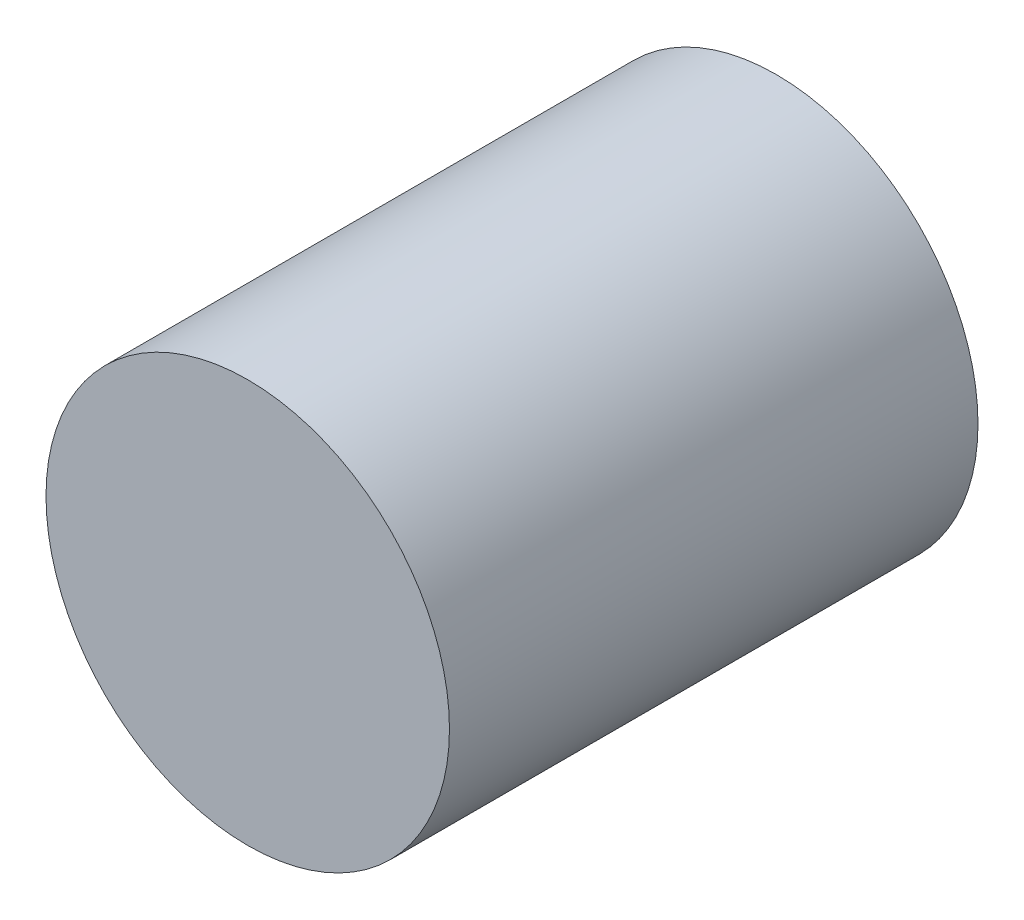
ISO-10303-21;
HEADER;
FILE_DESCRIPTION(('STEP AP214'),'2;1');
FILE_NAME('part.step','',(''),(''),'','','');
FILE_SCHEMA(('AUTOMOTIVE_DESIGN { 1 0 10303 214 1 1 1 1 }'));
ENDSEC;
DATA;
#1=APPLICATION_CONTEXT('core data for automotive mechanical design processes');
#2=APPLICATION_PROTOCOL_DEFINITION('international standard','automotive_design',2000,#1);
#3=PRODUCT_CONTEXT('',#1,'mechanical');
#4=PRODUCT('Part','Part','',(#3));
#5=PRODUCT_RELATED_PRODUCT_CATEGORY('part','',(#4));
#6=PRODUCT_DEFINITION_FORMATION('','',#4);
#7=PRODUCT_DEFINITION_CONTEXT('part definition',#1,'design');
#8=PRODUCT_DEFINITION('design','',#6,#7);
#9=PRODUCT_DEFINITION_SHAPE('','',#8);
#10=(LENGTH_UNIT() NAMED_UNIT(*) SI_UNIT(.MILLI.,.METRE.));
#11=(NAMED_UNIT(*) PLANE_ANGLE_UNIT() SI_UNIT($,.RADIAN.));
#12=(NAMED_UNIT(*) SI_UNIT($,.STERADIAN.) SOLID_ANGLE_UNIT());
#13=UNCERTAINTY_MEASURE_WITH_UNIT(LENGTH_MEASURE(1.E-05),#10,'distance_accuracy_value','');
#14=(GEOMETRIC_REPRESENTATION_CONTEXT(3) GLOBAL_UNCERTAINTY_ASSIGNED_CONTEXT((#13)) GLOBAL_UNIT_ASSIGNED_CONTEXT((#10,
#11,#12)) REPRESENTATION_CONTEXT('',''));
#15=CARTESIAN_POINT('',(0.,0.,0.));
#16=DIRECTION('',(0.,0.,1.));
#17=DIRECTION('',(1.,0.,0.));
#18=AXIS2_PLACEMENT_3D('',#15,#16,#17);
#19=CARTESIAN_POINT('',(0.,0.,0.));
#20=DIRECTION('',(0.,0.,1.));
#21=DIRECTION('',(1.,0.,0.));
#22=AXIS2_PLACEMENT_3D('',#19,#20,#21);
#23=PLANE('',#22);
#24=CARTESIAN_POINT('',(0.,0.,0.));
#25=DIRECTION('',(0.,0.,1.));
#26=DIRECTION('',(1.,0.,0.));
#27=AXIS2_PLACEMENT_3D('',#24,#25,#26);
#28=CIRCLE('',#27,10.);
#29=CARTESIAN_POINT('',(10.,0.,0.));
#30=VERTEX_POINT('',#29);
#31=EDGE_CURVE('E45',#30,#30,#28,.T.);
#32=ORIENTED_EDGE('',*,*,#31,.F.);
#33=EDGE_LOOP('',(#32));
#34=FACE_BOUND('',#33,.T.);
#35=CARTESIAN_POINT('',(0.,0.,0.));
#36=DIRECTION('',(0.,0.,1.));
#37=DIRECTION('',(1.,0.,0.));
#38=AXIS2_PLACEMENT_3D('',#35,#36,#37);
#39=CIRCLE('',#38,8.);
#40=CARTESIAN_POINT('',(8.,0.,0.));
#41=VERTEX_POINT('',#40);
#42=EDGE_CURVE('E50',#41,#41,#39,.T.);
#43=ORIENTED_EDGE('',*,*,#42,.T.);
#44=EDGE_LOOP('',(#43));
#45=FACE_BOUND('',#44,.T.);
#46=ADVANCED_FACE('F37',(#34,#45),#23,.F.);
#47=CARTESIAN_POINT('',(0.,0.,24.2));
#48=DIRECTION('',(0.,0.,-1.));
#49=DIRECTION('',(-1.,0.,0.));
#50=AXIS2_PLACEMENT_3D('',#47,#48,#49);
#51=CYLINDRICAL_SURFACE('',#50,10.);
#52=ORIENTED_EDGE('',*,*,#31,.T.);
#53=EDGE_LOOP('',(#52));
#54=FACE_BOUND('',#53,.T.);
#55=CARTESIAN_POINT('',(0.,0.,26.2));
#56=DIRECTION('',(0.,0.,1.));
#57=DIRECTION('',(1.,0.,0.));
#58=AXIS2_PLACEMENT_3D('',#55,#56,#57);
#59=CIRCLE('',#58,10.);
#60=CARTESIAN_POINT('',(10.,0.,26.2));
#61=VERTEX_POINT('',#60);
#62=EDGE_CURVE('E61',#61,#61,#59,.T.);
#63=ORIENTED_EDGE('',*,*,#62,.F.);
#64=EDGE_LOOP('',(#63));
#65=FACE_BOUND('',#64,.T.);
#66=ADVANCED_FACE('F39',(#54,#65),#51,.T.);
#67=CARTESIAN_POINT('',(0.,0.,24.2));
#68=DIRECTION('',(0.,0.,-1.));
#69=DIRECTION('',(-1.,0.,0.));
#70=AXIS2_PLACEMENT_3D('',#67,#68,#69);
#71=CYLINDRICAL_SURFACE('',#70,8.);
#72=CARTESIAN_POINT('',(0.,0.,24.2));
#73=DIRECTION('',(0.,0.,1.));
#74=DIRECTION('',(1.,0.,0.));
#75=AXIS2_PLACEMENT_3D('',#72,#73,#74);
#76=CIRCLE('',#75,8.);
#77=CARTESIAN_POINT('',(8.,0.,24.2));
#78=VERTEX_POINT('',#77);
#79=EDGE_CURVE('E55',#78,#78,#76,.T.);
#80=ORIENTED_EDGE('',*,*,#79,.T.);
#81=EDGE_LOOP('',(#80));
#82=FACE_BOUND('',#81,.T.);
#83=ORIENTED_EDGE('',*,*,#42,.F.);
#84=EDGE_LOOP('',(#83));
#85=FACE_BOUND('',#84,.T.);
#86=ADVANCED_FACE('F85',(#82,#85),#71,.F.);
#87=CARTESIAN_POINT('',(0.,0.,24.2));
#88=DIRECTION('',(0.,0.,1.));
#89=DIRECTION('',(1.,0.,0.));
#90=AXIS2_PLACEMENT_3D('',#87,#88,#89);
#91=PLANE('',#90);
#92=CARTESIAN_POINT('',(0.,0.,24.2));
#93=DIRECTION('',(0.,0.,1.));
#94=DIRECTION('',(1.,0.,0.));
#95=AXIS2_PLACEMENT_3D('',#92,#93,#94);
#96=CIRCLE('',#95,3.);
#97=CARTESIAN_POINT('',(3.,0.,24.2));
#98=VERTEX_POINT('',#97);
#99=EDGE_CURVE('E10',#98,#98,#96,.F.);
#100=ORIENTED_EDGE('',*,*,#99,.F.);
#101=EDGE_LOOP('',(#100));
#102=FACE_BOUND('',#101,.T.);
#103=ORIENTED_EDGE('',*,*,#79,.F.);
#104=EDGE_LOOP('',(#103));
#105=FACE_BOUND('',#104,.T.);
#106=ADVANCED_FACE('F90',(#102,#105),#91,.F.);
#107=CARTESIAN_POINT('',(0.,0.,26.2));
#108=DIRECTION('',(0.,0.,1.));
#109=DIRECTION('',(1.,0.,0.));
#110=AXIS2_PLACEMENT_3D('',#107,#108,#109);
#111=PLANE('',#110);
#112=ORIENTED_EDGE('',*,*,#62,.T.);
#113=EDGE_LOOP('',(#112));
#114=FACE_BOUND('',#113,.T.);
#115=ADVANCED_FACE('F78',(#114),#111,.T.);
#116=CARTESIAN_POINT('',(0.,0.,-8.48528137423857));
#117=DIRECTION('',(0.,0.,1.));
#118=DIRECTION('',(1.,0.,0.));
#119=AXIS2_PLACEMENT_3D('',#116,#117,#118);
#120=CYLINDRICAL_SURFACE('',#119,3.);
#121=CARTESIAN_POINT('',(0.,0.,0.));
#122=DIRECTION('',(0.,0.,1.));
#123=DIRECTION('',(1.,0.,0.));
#124=AXIS2_PLACEMENT_3D('',#121,#122,#123);
#125=CIRCLE('',#124,3.);
#126=CARTESIAN_POINT('',(3.,0.,0.));
#127=VERTEX_POINT('',#126);
#128=EDGE_CURVE('E65',#127,#127,#125,.T.);
#129=ORIENTED_EDGE('',*,*,#128,.T.);
#130=EDGE_LOOP('',(#129));
#131=FACE_BOUND('',#130,.T.);
#132=ORIENTED_EDGE('',*,*,#99,.T.);
#133=EDGE_LOOP('',(#132));
#134=FACE_BOUND('',#133,.T.);
#135=ADVANCED_FACE('F70',(#131,#134),#120,.T.);
#136=CARTESIAN_POINT('',(0.,0.,0.));
#137=DIRECTION('',(0.,0.,1.));
#138=DIRECTION('',(1.,0.,0.));
#139=AXIS2_PLACEMENT_3D('',#136,#137,#138);
#140=PLANE('',#139);
#141=ORIENTED_EDGE('',*,*,#128,.F.);
#142=EDGE_LOOP('',(#141));
#143=FACE_BOUND('',#142,.T.);
#144=ADVANCED_FACE('F72',(#143),#140,.F.);
#145=CLOSED_SHELL('',(#46,#66,#86,#106,#115,#135,#144));
#146=MANIFOLD_SOLID_BREP('B2',#145);
#147=ADVANCED_BREP_SHAPE_REPRESENTATION('',(#18,#146),#14);
#148=SHAPE_DEFINITION_REPRESENTATION(#9,#147);
ENDSEC;
END-ISO-10303-21;
